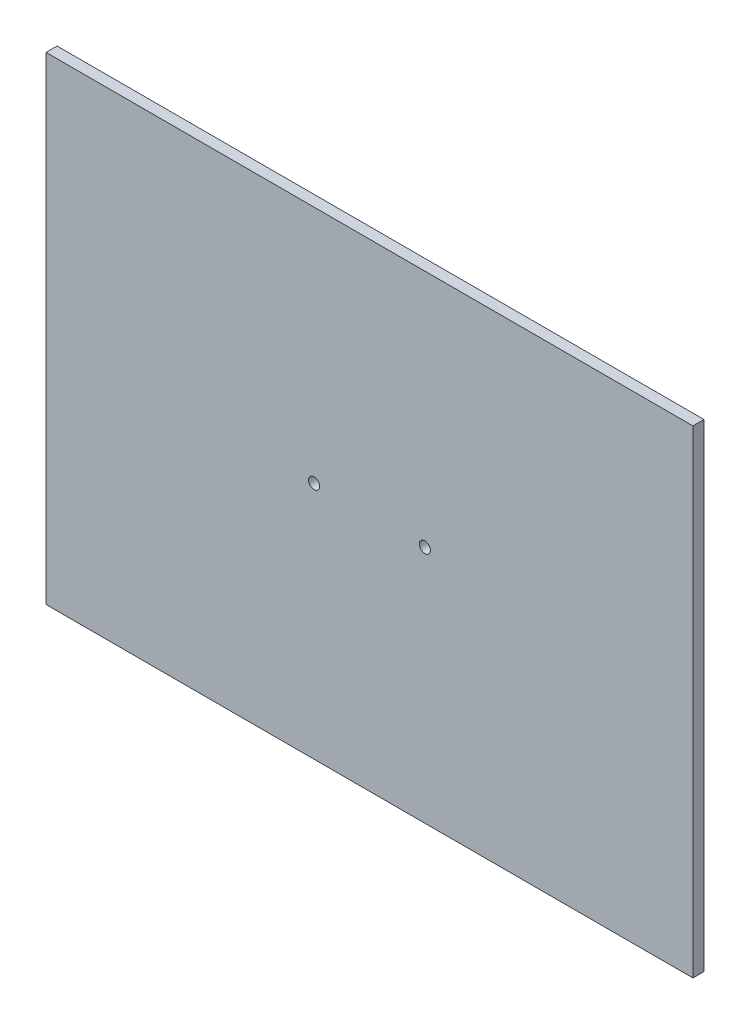
ISO-10303-21;
HEADER;
FILE_DESCRIPTION(('STEP AP214'),'2;1');
FILE_NAME('part.step','',(''),(''),'','','');
FILE_SCHEMA(('AUTOMOTIVE_DESIGN { 1 0 10303 214 1 1 1 1 }'));
ENDSEC;
DATA;
#1=APPLICATION_CONTEXT('core data for automotive mechanical design processes');
#2=APPLICATION_PROTOCOL_DEFINITION('international standard','automotive_design',2000,#1);
#3=PRODUCT_CONTEXT('',#1,'mechanical');
#4=PRODUCT('Part','Part','',(#3));
#5=PRODUCT_RELATED_PRODUCT_CATEGORY('part','',(#4));
#6=PRODUCT_DEFINITION_FORMATION('','',#4);
#7=PRODUCT_DEFINITION_CONTEXT('part definition',#1,'design');
#8=PRODUCT_DEFINITION('design','',#6,#7);
#9=PRODUCT_DEFINITION_SHAPE('','',#8);
#10=(LENGTH_UNIT() NAMED_UNIT(*) SI_UNIT(.MILLI.,.METRE.));
#11=(NAMED_UNIT(*) PLANE_ANGLE_UNIT() SI_UNIT($,.RADIAN.));
#12=(NAMED_UNIT(*) SI_UNIT($,.STERADIAN.) SOLID_ANGLE_UNIT());
#13=UNCERTAINTY_MEASURE_WITH_UNIT(LENGTH_MEASURE(1.E-05),#10,'distance_accuracy_value','');
#14=(GEOMETRIC_REPRESENTATION_CONTEXT(3) GLOBAL_UNCERTAINTY_ASSIGNED_CONTEXT((#13)) GLOBAL_UNIT_ASSIGNED_CONTEXT((#10,
#11,#12)) REPRESENTATION_CONTEXT('',''));
#15=CARTESIAN_POINT('',(0.,0.,0.));
#16=DIRECTION('',(0.,0.,1.));
#17=DIRECTION('',(1.,0.,0.));
#18=AXIS2_PLACEMENT_3D('',#15,#16,#17);
#19=CARTESIAN_POINT('',(146.05,-107.95,5.));
#20=DIRECTION('',(-1.,0.,0.));
#21=DIRECTION('',(0.,0.,1.));
#22=AXIS2_PLACEMENT_3D('',#19,#20,#21);
#23=PLANE('',#22);
#24=DIRECTION('',(0.,1.,0.));
#25=VECTOR('',#24,1.);
#26=CARTESIAN_POINT('',(146.05,-107.95,0.));
#27=LINE('',#26,#25);
#28=CARTESIAN_POINT('',(146.05,-107.95,0.));
#29=VERTEX_POINT('',#28);
#30=CARTESIAN_POINT('',(146.05,107.95,0.));
#31=VERTEX_POINT('',#30);
#32=EDGE_CURVE('E96',#29,#31,#27,.T.);
#33=ORIENTED_EDGE('',*,*,#32,.T.);
#34=DIRECTION('',(0.,0.,-1.));
#35=VECTOR('',#34,1.);
#36=CARTESIAN_POINT('',(146.05,107.95,5.));
#37=LINE('',#36,#35);
#38=CARTESIAN_POINT('',(146.05,107.95,5.));
#39=VERTEX_POINT('',#38);
#40=EDGE_CURVE('E11',#39,#31,#37,.T.);
#41=ORIENTED_EDGE('',*,*,#40,.F.);
#42=DIRECTION('',(0.,1.,0.));
#43=VECTOR('',#42,1.);
#44=CARTESIAN_POINT('',(146.05,-107.95,5.));
#45=LINE('',#44,#43);
#46=CARTESIAN_POINT('',(146.05,-107.95,5.));
#47=VERTEX_POINT('',#46);
#48=EDGE_CURVE('E84',#47,#39,#45,.T.);
#49=ORIENTED_EDGE('',*,*,#48,.F.);
#50=DIRECTION('',(0.,0.,-1.));
#51=VECTOR('',#50,1.);
#52=CARTESIAN_POINT('',(146.05,-107.95,5.));
#53=LINE('',#52,#51);
#54=EDGE_CURVE('E92',#47,#29,#53,.T.);
#55=ORIENTED_EDGE('',*,*,#54,.T.);
#56=EDGE_LOOP('',(#33,#41,#49,#55));
#57=FACE_BOUND('',#56,.T.);
#58=ADVANCED_FACE('F33',(#57),#23,.F.);
#59=CARTESIAN_POINT('',(-146.05,107.95,5.));
#60=DIRECTION('',(0.,-1.,0.));
#61=DIRECTION('',(0.,0.,-1.));
#62=AXIS2_PLACEMENT_3D('',#59,#60,#61);
#63=PLANE('',#62);
#64=DIRECTION('',(-1.,0.,0.));
#65=VECTOR('',#64,1.);
#66=CARTESIAN_POINT('',(-146.05,107.95,0.));
#67=LINE('',#66,#65);
#68=CARTESIAN_POINT('',(-146.05,107.95,0.));
#69=VERTEX_POINT('',#68);
#70=EDGE_CURVE('E88',#31,#69,#67,.T.);
#71=ORIENTED_EDGE('',*,*,#70,.T.);
#72=DIRECTION('',(0.,0.,-1.));
#73=VECTOR('',#72,1.);
#74=CARTESIAN_POINT('',(-146.05,107.95,5.));
#75=LINE('',#74,#73);
#76=CARTESIAN_POINT('',(-146.05,107.95,5.));
#77=VERTEX_POINT('',#76);
#78=EDGE_CURVE('E41',#77,#69,#75,.T.);
#79=ORIENTED_EDGE('',*,*,#78,.F.);
#80=DIRECTION('',(-1.,0.,0.));
#81=VECTOR('',#80,1.);
#82=CARTESIAN_POINT('',(-146.05,107.95,5.));
#83=LINE('',#82,#81);
#84=EDGE_CURVE('E79',#39,#77,#83,.T.);
#85=ORIENTED_EDGE('',*,*,#84,.F.);
#86=ORIENTED_EDGE('',*,*,#40,.T.);
#87=EDGE_LOOP('',(#71,#79,#85,#86));
#88=FACE_BOUND('',#87,.T.);
#89=ADVANCED_FACE('F87',(#88),#63,.F.);
#90=CARTESIAN_POINT('',(-146.05,-107.95,5.));
#91=DIRECTION('',(1.,0.,0.));
#92=DIRECTION('',(0.,0.,-1.));
#93=AXIS2_PLACEMENT_3D('',#90,#91,#92);
#94=PLANE('',#93);
#95=DIRECTION('',(0.,-1.,0.));
#96=VECTOR('',#95,1.);
#97=CARTESIAN_POINT('',(-146.05,-107.95,0.));
#98=LINE('',#97,#96);
#99=CARTESIAN_POINT('',(-146.05,-107.95,0.));
#100=VERTEX_POINT('',#99);
#101=EDGE_CURVE('E66',#69,#100,#98,.T.);
#102=ORIENTED_EDGE('',*,*,#101,.T.);
#103=DIRECTION('',(0.,0.,-1.));
#104=VECTOR('',#103,1.);
#105=CARTESIAN_POINT('',(-146.05,-107.95,5.));
#106=LINE('',#105,#104);
#107=CARTESIAN_POINT('',(-146.05,-107.95,5.));
#108=VERTEX_POINT('',#107);
#109=EDGE_CURVE('E89',#108,#100,#106,.T.);
#110=ORIENTED_EDGE('',*,*,#109,.F.);
#111=DIRECTION('',(0.,-1.,0.));
#112=VECTOR('',#111,1.);
#113=CARTESIAN_POINT('',(-146.05,-107.95,5.));
#114=LINE('',#113,#112);
#115=EDGE_CURVE('E82',#77,#108,#114,.T.);
#116=ORIENTED_EDGE('',*,*,#115,.F.);
#117=ORIENTED_EDGE('',*,*,#78,.T.);
#118=EDGE_LOOP('',(#102,#110,#116,#117));
#119=FACE_BOUND('',#118,.T.);
#120=ADVANCED_FACE('F90',(#119),#94,.F.);
#121=CARTESIAN_POINT('',(-146.05,-107.95,5.));
#122=DIRECTION('',(0.,1.,0.));
#123=DIRECTION('',(0.,0.,1.));
#124=AXIS2_PLACEMENT_3D('',#121,#122,#123);
#125=PLANE('',#124);
#126=DIRECTION('',(1.,0.,0.));
#127=VECTOR('',#126,1.);
#128=CARTESIAN_POINT('',(-146.05,-107.95,0.));
#129=LINE('',#128,#127);
#130=EDGE_CURVE('E72',#100,#29,#129,.T.);
#131=ORIENTED_EDGE('',*,*,#130,.T.);
#132=ORIENTED_EDGE('',*,*,#54,.F.);
#133=DIRECTION('',(1.,0.,0.));
#134=VECTOR('',#133,1.);
#135=CARTESIAN_POINT('',(-146.05,-107.95,5.));
#136=LINE('',#135,#134);
#137=EDGE_CURVE('E49',#108,#47,#136,.T.);
#138=ORIENTED_EDGE('',*,*,#137,.F.);
#139=ORIENTED_EDGE('',*,*,#109,.T.);
#140=EDGE_LOOP('',(#131,#132,#138,#139));
#141=FACE_BOUND('',#140,.T.);
#142=ADVANCED_FACE('F104',(#141),#125,.F.);
#143=CARTESIAN_POINT('',(0.,0.,5.));
#144=DIRECTION('',(0.,0.,-1.));
#145=DIRECTION('',(-1.,0.,0.));
#146=AXIS2_PLACEMENT_3D('',#143,#144,#145);
#147=PLANE('',#146);
#148=CARTESIAN_POINT('',(25.,0.,5.));
#149=DIRECTION('',(0.,0.,-1.));
#150=DIRECTION('',(-1.,0.,0.));
#151=AXIS2_PLACEMENT_3D('',#148,#149,#150);
#152=CIRCLE('',#151,2.5);
#153=CARTESIAN_POINT('',(22.5,0.,5.));
#154=VERTEX_POINT('',#153);
#155=EDGE_CURVE('E99',#154,#154,#152,.T.);
#156=ORIENTED_EDGE('',*,*,#155,.T.);
#157=EDGE_LOOP('',(#156));
#158=FACE_BOUND('',#157,.T.);
#159=CARTESIAN_POINT('',(-25.,0.,5.));
#160=DIRECTION('',(0.,0.,-1.));
#161=DIRECTION('',(-1.,0.,0.));
#162=AXIS2_PLACEMENT_3D('',#159,#160,#161);
#163=CIRCLE('',#162,2.5);
#164=CARTESIAN_POINT('',(-27.5,0.,5.));
#165=VERTEX_POINT('',#164);
#166=EDGE_CURVE('E113',#165,#165,#163,.T.);
#167=ORIENTED_EDGE('',*,*,#166,.T.);
#168=EDGE_LOOP('',(#167));
#169=FACE_BOUND('',#168,.T.);
#170=ORIENTED_EDGE('',*,*,#48,.T.);
#171=ORIENTED_EDGE('',*,*,#84,.T.);
#172=ORIENTED_EDGE('',*,*,#115,.T.);
#173=ORIENTED_EDGE('',*,*,#137,.T.);
#174=EDGE_LOOP('',(#170,#171,#172,#173));
#175=FACE_BOUND('',#174,.T.);
#176=ADVANCED_FACE('F80',(#158,#169,#175),#147,.F.);
#177=CARTESIAN_POINT('',(0.,0.,0.));
#178=DIRECTION('',(0.,0.,-1.));
#179=DIRECTION('',(-1.,0.,0.));
#180=AXIS2_PLACEMENT_3D('',#177,#178,#179);
#181=PLANE('',#180);
#182=CARTESIAN_POINT('',(25.,0.,0.));
#183=DIRECTION('',(0.,0.,-1.));
#184=DIRECTION('',(-1.,0.,0.));
#185=AXIS2_PLACEMENT_3D('',#182,#183,#184);
#186=CIRCLE('',#185,2.5);
#187=CARTESIAN_POINT('',(22.5,0.,0.));
#188=VERTEX_POINT('',#187);
#189=EDGE_CURVE('E116',#188,#188,#186,.T.);
#190=ORIENTED_EDGE('',*,*,#189,.F.);
#191=EDGE_LOOP('',(#190));
#192=FACE_BOUND('',#191,.T.);
#193=CARTESIAN_POINT('',(-25.,0.,0.));
#194=DIRECTION('',(0.,0.,-1.));
#195=DIRECTION('',(-1.,0.,0.));
#196=AXIS2_PLACEMENT_3D('',#193,#194,#195);
#197=CIRCLE('',#196,2.5);
#198=CARTESIAN_POINT('',(-27.5,0.,0.));
#199=VERTEX_POINT('',#198);
#200=EDGE_CURVE('E110',#199,#199,#197,.T.);
#201=ORIENTED_EDGE('',*,*,#200,.F.);
#202=EDGE_LOOP('',(#201));
#203=FACE_BOUND('',#202,.T.);
#204=ORIENTED_EDGE('',*,*,#32,.F.);
#205=ORIENTED_EDGE('',*,*,#130,.F.);
#206=ORIENTED_EDGE('',*,*,#101,.F.);
#207=ORIENTED_EDGE('',*,*,#70,.F.);
#208=EDGE_LOOP('',(#204,#205,#206,#207));
#209=FACE_BOUND('',#208,.T.);
#210=ADVANCED_FACE('F107',(#192,#203,#209),#181,.T.);
#211=CARTESIAN_POINT('',(-25.,0.,5.));
#212=DIRECTION('',(0.,0.,-1.));
#213=DIRECTION('',(-1.,0.,0.));
#214=AXIS2_PLACEMENT_3D('',#211,#212,#213);
#215=CYLINDRICAL_SURFACE('',#214,2.5);
#216=ORIENTED_EDGE('',*,*,#166,.F.);
#217=EDGE_LOOP('',(#216));
#218=FACE_BOUND('',#217,.T.);
#219=ORIENTED_EDGE('',*,*,#200,.T.);
#220=EDGE_LOOP('',(#219));
#221=FACE_BOUND('',#220,.T.);
#222=ADVANCED_FACE('F127',(#218,#221),#215,.F.);
#223=CARTESIAN_POINT('',(25.,0.,5.));
#224=DIRECTION('',(0.,0.,-1.));
#225=DIRECTION('',(-1.,0.,0.));
#226=AXIS2_PLACEMENT_3D('',#223,#224,#225);
#227=CYLINDRICAL_SURFACE('',#226,2.5);
#228=ORIENTED_EDGE('',*,*,#155,.F.);
#229=EDGE_LOOP('',(#228));
#230=FACE_BOUND('',#229,.T.);
#231=ORIENTED_EDGE('',*,*,#189,.T.);
#232=EDGE_LOOP('',(#231));
#233=FACE_BOUND('',#232,.T.);
#234=ADVANCED_FACE('F124',(#230,#233),#227,.F.);
#235=CLOSED_SHELL('',(#58,#89,#120,#142,#176,#210,#222,#234));
#236=MANIFOLD_SOLID_BREP('B2',#235);
#237=ADVANCED_BREP_SHAPE_REPRESENTATION('',(#18,#236),#14);
#238=SHAPE_DEFINITION_REPRESENTATION(#9,#237);
ENDSEC;
END-ISO-10303-21;
